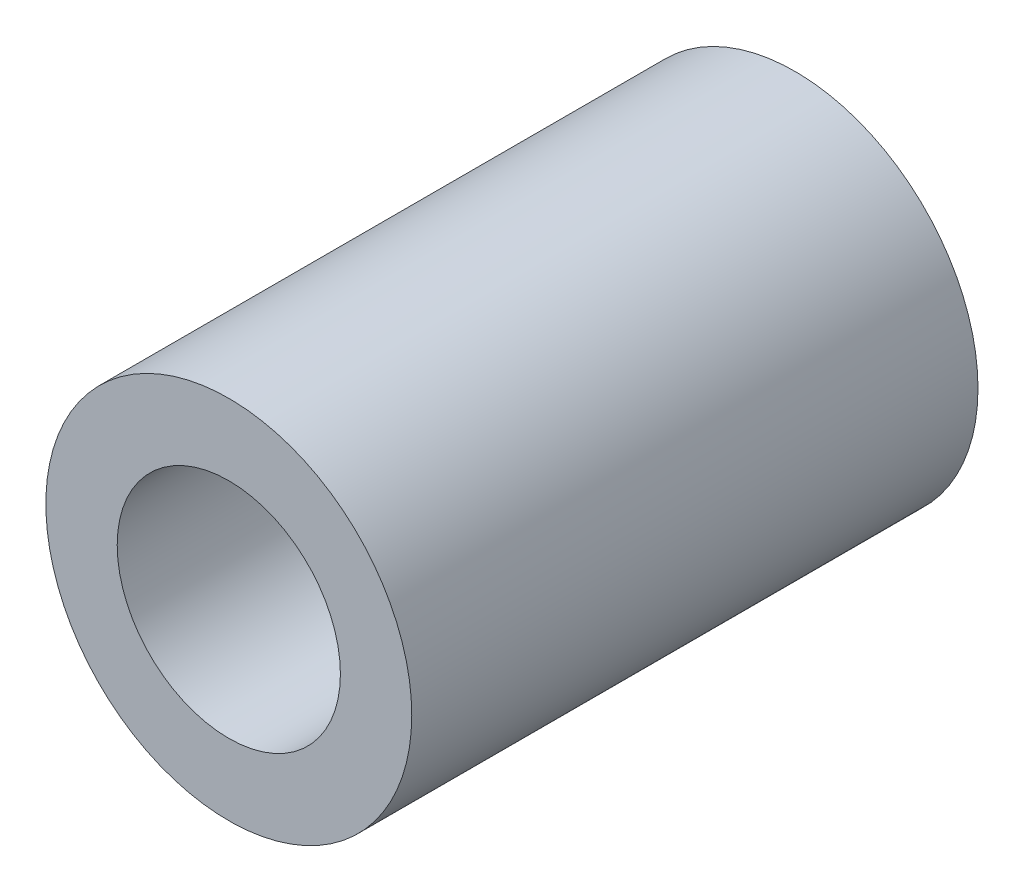
ISO-10303-21;
HEADER;
FILE_DESCRIPTION(('STEP AP214'),'2;1');
FILE_NAME('part.step','',(''),(''),'','','');
FILE_SCHEMA(('AUTOMOTIVE_DESIGN { 1 0 10303 214 1 1 1 1 }'));
ENDSEC;
DATA;
#1=APPLICATION_CONTEXT('core data for automotive mechanical design processes');
#2=APPLICATION_PROTOCOL_DEFINITION('international standard','automotive_design',2000,#1);
#3=PRODUCT_CONTEXT('',#1,'mechanical');
#4=PRODUCT('Part','Part','',(#3));
#5=PRODUCT_RELATED_PRODUCT_CATEGORY('part','',(#4));
#6=PRODUCT_DEFINITION_FORMATION('','',#4);
#7=PRODUCT_DEFINITION_CONTEXT('part definition',#1,'design');
#8=PRODUCT_DEFINITION('design','',#6,#7);
#9=PRODUCT_DEFINITION_SHAPE('','',#8);
#10=(LENGTH_UNIT() NAMED_UNIT(*) SI_UNIT(.MILLI.,.METRE.));
#11=(NAMED_UNIT(*) PLANE_ANGLE_UNIT() SI_UNIT($,.RADIAN.));
#12=(NAMED_UNIT(*) SI_UNIT($,.STERADIAN.) SOLID_ANGLE_UNIT());
#13=UNCERTAINTY_MEASURE_WITH_UNIT(LENGTH_MEASURE(1.E-05),#10,'distance_accuracy_value','');
#14=(GEOMETRIC_REPRESENTATION_CONTEXT(3) GLOBAL_UNCERTAINTY_ASSIGNED_CONTEXT((#13)) GLOBAL_UNIT_ASSIGNED_CONTEXT((#10,
#11,#12)) REPRESENTATION_CONTEXT('',''));
#15=CARTESIAN_POINT('',(0.,0.,0.));
#16=DIRECTION('',(0.,0.,1.));
#17=DIRECTION('',(1.,0.,0.));
#18=AXIS2_PLACEMENT_3D('',#15,#16,#17);
#19=CARTESIAN_POINT('',(0.,0.,15.475));
#20=DIRECTION('',(0.,0.,1.));
#21=DIRECTION('',(1.,0.,0.));
#22=AXIS2_PLACEMENT_3D('',#19,#20,#21);
#23=PLANE('',#22);
#24=CARTESIAN_POINT('',(0.,0.,15.475));
#25=DIRECTION('',(0.,0.,1.));
#26=DIRECTION('',(1.,0.,0.));
#27=AXIS2_PLACEMENT_3D('',#24,#25,#26);
#28=CIRCLE('',#27,10.);
#29=CARTESIAN_POINT('',(10.,0.,15.475));
#30=VERTEX_POINT('',#29);
#31=EDGE_CURVE('E10',#30,#30,#28,.T.);
#32=ORIENTED_EDGE('',*,*,#31,.T.);
#33=EDGE_LOOP('',(#32));
#34=FACE_BOUND('',#33,.T.);
#35=CARTESIAN_POINT('',(0.,0.,15.475));
#36=DIRECTION('',(0.,0.,1.));
#37=DIRECTION('',(1.,0.,0.));
#38=AXIS2_PLACEMENT_3D('',#35,#36,#37);
#39=CIRCLE('',#38,6.1);
#40=CARTESIAN_POINT('',(6.1,0.,15.475));
#41=VERTEX_POINT('',#40);
#42=EDGE_CURVE('E50',#41,#41,#39,.T.);
#43=ORIENTED_EDGE('',*,*,#42,.F.);
#44=EDGE_LOOP('',(#43));
#45=FACE_BOUND('',#44,.T.);
#46=ADVANCED_FACE('F37',(#34,#45),#23,.T.);
#47=CARTESIAN_POINT('',(0.,0.,-15.475));
#48=DIRECTION('',(0.,0.,1.));
#49=DIRECTION('',(1.,0.,0.));
#50=AXIS2_PLACEMENT_3D('',#47,#48,#49);
#51=PLANE('',#50);
#52=CARTESIAN_POINT('',(0.,0.,-15.475));
#53=DIRECTION('',(0.,0.,1.));
#54=DIRECTION('',(1.,0.,0.));
#55=AXIS2_PLACEMENT_3D('',#52,#53,#54);
#56=CIRCLE('',#55,10.);
#57=CARTESIAN_POINT('',(10.,0.,-15.475));
#58=VERTEX_POINT('',#57);
#59=EDGE_CURVE('E41',#58,#58,#56,.T.);
#60=ORIENTED_EDGE('',*,*,#59,.F.);
#61=EDGE_LOOP('',(#60));
#62=FACE_BOUND('',#61,.T.);
#63=CARTESIAN_POINT('',(0.,0.,-15.475));
#64=DIRECTION('',(0.,0.,1.));
#65=DIRECTION('',(1.,0.,0.));
#66=AXIS2_PLACEMENT_3D('',#63,#64,#65);
#67=CIRCLE('',#66,6.1);
#68=CARTESIAN_POINT('',(6.1,0.,-15.475));
#69=VERTEX_POINT('',#68);
#70=EDGE_CURVE('E52',#69,#69,#67,.T.);
#71=ORIENTED_EDGE('',*,*,#70,.T.);
#72=EDGE_LOOP('',(#71));
#73=FACE_BOUND('',#72,.T.);
#74=ADVANCED_FACE('F64',(#62,#73),#51,.F.);
#75=CARTESIAN_POINT('',(0.,0.,15.475));
#76=DIRECTION('',(0.,0.,-1.));
#77=DIRECTION('',(-1.,0.,0.));
#78=AXIS2_PLACEMENT_3D('',#75,#76,#77);
#79=CYLINDRICAL_SURFACE('',#78,10.);
#80=ORIENTED_EDGE('',*,*,#31,.F.);
#81=EDGE_LOOP('',(#80));
#82=FACE_BOUND('',#81,.T.);
#83=ORIENTED_EDGE('',*,*,#59,.T.);
#84=EDGE_LOOP('',(#83));
#85=FACE_BOUND('',#84,.T.);
#86=ADVANCED_FACE('F39',(#82,#85),#79,.T.);
#87=CARTESIAN_POINT('',(0.,0.,15.475));
#88=DIRECTION('',(0.,0.,-1.));
#89=DIRECTION('',(-1.,0.,0.));
#90=AXIS2_PLACEMENT_3D('',#87,#88,#89);
#91=CYLINDRICAL_SURFACE('',#90,6.1);
#92=ORIENTED_EDGE('',*,*,#42,.T.);
#93=EDGE_LOOP('',(#92));
#94=FACE_BOUND('',#93,.T.);
#95=ORIENTED_EDGE('',*,*,#70,.F.);
#96=EDGE_LOOP('',(#95));
#97=FACE_BOUND('',#96,.T.);
#98=ADVANCED_FACE('F60',(#94,#97),#91,.F.);
#99=CLOSED_SHELL('',(#46,#74,#86,#98));
#100=MANIFOLD_SOLID_BREP('B2',#99);
#101=ADVANCED_BREP_SHAPE_REPRESENTATION('',(#18,#100),#14);
#102=SHAPE_DEFINITION_REPRESENTATION(#9,#101);
ENDSEC;
END-ISO-10303-21;
